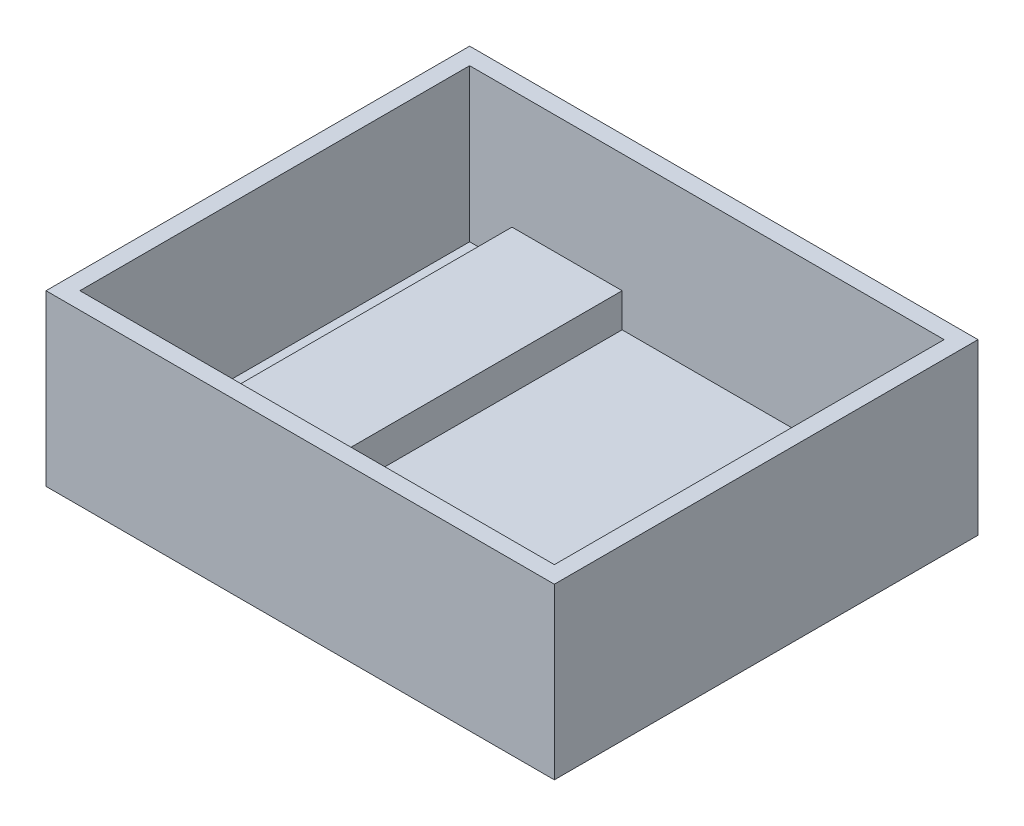
ISO-10303-21;
HEADER;
FILE_DESCRIPTION(('STEP AP214'),'2;1');
FILE_NAME('part.step','',(''),(''),'','','');
FILE_SCHEMA(('AUTOMOTIVE_DESIGN { 1 0 10303 214 1 1 1 1 }'));
ENDSEC;
DATA;
#1=APPLICATION_CONTEXT('core data for automotive mechanical design processes');
#2=APPLICATION_PROTOCOL_DEFINITION('international standard','automotive_design',2000,#1);
#3=PRODUCT_CONTEXT('',#1,'mechanical');
#4=PRODUCT('Part','Part','',(#3));
#5=PRODUCT_RELATED_PRODUCT_CATEGORY('part','',(#4));
#6=PRODUCT_DEFINITION_FORMATION('','',#4);
#7=PRODUCT_DEFINITION_CONTEXT('part definition',#1,'design');
#8=PRODUCT_DEFINITION('design','',#6,#7);
#9=PRODUCT_DEFINITION_SHAPE('','',#8);
#10=(LENGTH_UNIT() NAMED_UNIT(*) SI_UNIT(.MILLI.,.METRE.));
#11=(NAMED_UNIT(*) PLANE_ANGLE_UNIT() SI_UNIT($,.RADIAN.));
#12=(NAMED_UNIT(*) SI_UNIT($,.STERADIAN.) SOLID_ANGLE_UNIT());
#13=UNCERTAINTY_MEASURE_WITH_UNIT(LENGTH_MEASURE(1.E-05),#10,'distance_accuracy_value','');
#14=(GEOMETRIC_REPRESENTATION_CONTEXT(3) GLOBAL_UNCERTAINTY_ASSIGNED_CONTEXT((#13)) GLOBAL_UNIT_ASSIGNED_CONTEXT((#10,
#11,#12)) REPRESENTATION_CONTEXT('',''));
#15=CARTESIAN_POINT('',(0.,0.,0.));
#16=DIRECTION('',(0.,0.,1.));
#17=DIRECTION('',(1.,0.,0.));
#18=AXIS2_PLACEMENT_3D('',#15,#16,#17);
#19=CARTESIAN_POINT('',(-66.5712229422652,4.,-56.0826927806848));
#20=DIRECTION('',(0.,0.,-1.));
#21=DIRECTION('',(-1.,0.,0.));
#22=AXIS2_PLACEMENT_3D('',#19,#20,#21);
#23=PLANE('',#22);
#24=DIRECTION('',(0.,-1.,0.));
#25=VECTOR('',#24,1.);
#26=CARTESIAN_POINT('',(-56.5712229422651,4.,-56.0826927806848));
#27=LINE('',#26,#25);
#28=CARTESIAN_POINT('',(-56.5712229422651,12.,-56.0826927806848));
#29=VERTEX_POINT('',#28);
#30=CARTESIAN_POINT('',(-56.5712229422651,4.,-56.0826927806848));
#31=VERTEX_POINT('',#30);
#32=EDGE_CURVE('E147',#29,#31,#27,.T.);
#33=ORIENTED_EDGE('',*,*,#32,.F.);
#34=DIRECTION('',(1.,0.,0.));
#35=VECTOR('',#34,1.);
#36=CARTESIAN_POINT('',(-66.5712229422652,12.,-56.0826927806848));
#37=LINE('',#36,#35);
#38=CARTESIAN_POINT('',(-30.5712229422651,12.,-56.0826927806848));
#39=VERTEX_POINT('',#38);
#40=EDGE_CURVE('E11',#29,#39,#37,.T.);
#41=ORIENTED_EDGE('',*,*,#40,.T.);
#42=DIRECTION('',(0.,1.,0.));
#43=VECTOR('',#42,1.);
#44=CARTESIAN_POINT('',(-30.5712229422651,4.,-56.0826927806848));
#45=LINE('',#44,#43);
#46=CARTESIAN_POINT('',(-30.5712229422651,4.,-56.0826927806848));
#47=VERTEX_POINT('',#46);
#48=EDGE_CURVE('E145',#47,#39,#45,.T.);
#49=ORIENTED_EDGE('',*,*,#48,.F.);
#50=DIRECTION('',(-1.,0.,0.));
#51=VECTOR('',#50,1.);
#52=CARTESIAN_POINT('',(-66.5712229422652,4.,-56.0826927806848));
#53=LINE('',#52,#51);
#54=CARTESIAN_POINT('',(45.4287770577348,4.,-56.0826927806848));
#55=VERTEX_POINT('',#54);
#56=EDGE_CURVE('E164',#55,#47,#53,.T.);
#57=ORIENTED_EDGE('',*,*,#56,.F.);
#58=DIRECTION('',(0.,1.,0.));
#59=VECTOR('',#58,1.);
#60=CARTESIAN_POINT('',(45.4287770577348,4.,-56.0826927806848));
#61=LINE('',#60,#59);
#62=CARTESIAN_POINT('',(45.4287770577348,40.,-56.0826927806848));
#63=VERTEX_POINT('',#62);
#64=EDGE_CURVE('E180',#55,#63,#61,.T.);
#65=ORIENTED_EDGE('',*,*,#64,.T.);
#66=DIRECTION('',(-1.,0.,0.));
#67=VECTOR('',#66,1.);
#68=CARTESIAN_POINT('',(-66.5712229422652,40.,-56.0826927806848));
#69=LINE('',#68,#67);
#70=CARTESIAN_POINT('',(-66.5712229422652,40.,-56.0826927806848));
#71=VERTEX_POINT('',#70);
#72=EDGE_CURVE('E157',#63,#71,#69,.T.);
#73=ORIENTED_EDGE('',*,*,#72,.T.);
#74=DIRECTION('',(0.,1.,0.));
#75=VECTOR('',#74,1.);
#76=CARTESIAN_POINT('',(-66.5712229422652,4.,-56.0826927806848));
#77=LINE('',#76,#75);
#78=CARTESIAN_POINT('',(-66.5712229422652,4.,-56.0826927806848));
#79=VERTEX_POINT('',#78);
#80=EDGE_CURVE('E177',#79,#71,#77,.T.);
#81=ORIENTED_EDGE('',*,*,#80,.F.);
#82=EDGE_CURVE('E163',#31,#79,#53,.T.);
#83=ORIENTED_EDGE('',*,*,#82,.F.);
#84=EDGE_LOOP('',(#33,#41,#49,#57,#65,#73,#81,#83));
#85=FACE_BOUND('',#84,.T.);
#86=ADVANCED_FACE('F37',(#85),#23,.F.);
#87=CARTESIAN_POINT('',(0.,4.,0.));
#88=DIRECTION('',(0.,1.,0.));
#89=DIRECTION('',(0.,0.,1.));
#90=AXIS2_PLACEMENT_3D('',#87,#88,#89);
#91=PLANE('',#90);
#92=DIRECTION('',(1.,0.,0.));
#93=VECTOR('',#92,1.);
#94=CARTESIAN_POINT('',(-56.5712229422652,4.,9.91730721931521));
#95=LINE('',#94,#93);
#96=CARTESIAN_POINT('',(-56.5712229422652,4.,9.91730721931521));
#97=VERTEX_POINT('',#96);
#98=CARTESIAN_POINT('',(-30.5712229422651,4.,9.91730721931521));
#99=VERTEX_POINT('',#98);
#100=EDGE_CURVE('E218',#97,#99,#95,.T.);
#101=ORIENTED_EDGE('',*,*,#100,.F.);
#102=DIRECTION('',(0.,0.,-1.));
#103=VECTOR('',#102,1.);
#104=CARTESIAN_POINT('',(-56.5712229422652,4.,0.));
#105=LINE('',#104,#103);
#106=EDGE_CURVE('E45',#97,#31,#105,.T.);
#107=ORIENTED_EDGE('',*,*,#106,.T.);
#108=ORIENTED_EDGE('',*,*,#82,.T.);
#109=DIRECTION('',(0.,0.,1.));
#110=VECTOR('',#109,1.);
#111=CARTESIAN_POINT('',(-66.5712229422652,4.,-56.0826927806848));
#112=LINE('',#111,#110);
#113=CARTESIAN_POINT('',(-66.5712229422651,4.,35.9173072193152));
#114=VERTEX_POINT('',#113);
#115=EDGE_CURVE('E153',#79,#114,#112,.T.);
#116=ORIENTED_EDGE('',*,*,#115,.T.);
#117=DIRECTION('',(1.,0.,0.));
#118=VECTOR('',#117,1.);
#119=CARTESIAN_POINT('',(-66.5712229422651,4.,35.9173072193152));
#120=LINE('',#119,#118);
#121=CARTESIAN_POINT('',(45.4287770577348,4.,35.9173072193152));
#122=VERTEX_POINT('',#121);
#123=EDGE_CURVE('E156',#114,#122,#120,.T.);
#124=ORIENTED_EDGE('',*,*,#123,.T.);
#125=DIRECTION('',(0.,0.,-1.));
#126=VECTOR('',#125,1.);
#127=CARTESIAN_POINT('',(45.4287770577348,4.,-56.0826927806848));
#128=LINE('',#127,#126);
#129=EDGE_CURVE('E160',#122,#55,#128,.T.);
#130=ORIENTED_EDGE('',*,*,#129,.T.);
#131=ORIENTED_EDGE('',*,*,#56,.T.);
#132=DIRECTION('',(0.,0.,-1.));
#133=VECTOR('',#132,1.);
#134=CARTESIAN_POINT('',(-30.5712229422651,4.,-60.0826927806848));
#135=LINE('',#134,#133);
#136=EDGE_CURVE('E134',#99,#47,#135,.T.);
#137=ORIENTED_EDGE('',*,*,#136,.F.);
#138=EDGE_LOOP('',(#101,#107,#108,#116,#124,#130,#131,#137));
#139=FACE_BOUND('',#138,.T.);
#140=ADVANCED_FACE('F215',(#139),#91,.T.);
#141=CARTESIAN_POINT('',(-70.5712229422652,40.,39.9173072193152));
#142=DIRECTION('',(1.,0.,0.));
#143=DIRECTION('',(0.,0.,-1.));
#144=AXIS2_PLACEMENT_3D('',#141,#142,#143);
#145=PLANE('',#144);
#146=DIRECTION('',(0.,0.,1.));
#147=VECTOR('',#146,1.);
#148=CARTESIAN_POINT('',(-70.5712229422652,0.,39.9173072193152));
#149=LINE('',#148,#147);
#150=CARTESIAN_POINT('',(-70.5712229422652,0.,-60.0826927806848));
#151=VERTEX_POINT('',#150);
#152=CARTESIAN_POINT('',(-70.5712229422652,0.,39.9173072193152));
#153=VERTEX_POINT('',#152);
#154=EDGE_CURVE('E179',#151,#153,#149,.T.);
#155=ORIENTED_EDGE('',*,*,#154,.T.);
#156=DIRECTION('',(0.,-1.,0.));
#157=VECTOR('',#156,1.);
#158=CARTESIAN_POINT('',(-70.5712229422652,40.,39.9173072193152));
#159=LINE('',#158,#157);
#160=CARTESIAN_POINT('',(-70.5712229422652,40.,39.9173072193152));
#161=VERTEX_POINT('',#160);
#162=EDGE_CURVE('E211',#161,#153,#159,.T.);
#163=ORIENTED_EDGE('',*,*,#162,.F.);
#164=DIRECTION('',(0.,0.,1.));
#165=VECTOR('',#164,1.);
#166=CARTESIAN_POINT('',(-70.5712229422652,40.,39.9173072193152));
#167=LINE('',#166,#165);
#168=CARTESIAN_POINT('',(-70.5712229422652,40.,-60.0826927806848));
#169=VERTEX_POINT('',#168);
#170=EDGE_CURVE('E185',#169,#161,#167,.T.);
#171=ORIENTED_EDGE('',*,*,#170,.F.);
#172=DIRECTION('',(0.,-1.,0.));
#173=VECTOR('',#172,1.);
#174=CARTESIAN_POINT('',(-70.5712229422652,40.,-60.0826927806848));
#175=LINE('',#174,#173);
#176=EDGE_CURVE('E195',#169,#151,#175,.T.);
#177=ORIENTED_EDGE('',*,*,#176,.T.);
#178=EDGE_LOOP('',(#155,#163,#171,#177));
#179=FACE_BOUND('',#178,.T.);
#180=ADVANCED_FACE('F39',(#179),#145,.F.);
#181=CARTESIAN_POINT('',(-70.5712229422652,40.,39.9173072193152));
#182=DIRECTION('',(0.,0.,-1.));
#183=DIRECTION('',(-1.,0.,0.));
#184=AXIS2_PLACEMENT_3D('',#181,#182,#183);
#185=PLANE('',#184);
#186=DIRECTION('',(1.,0.,0.));
#187=VECTOR('',#186,1.);
#188=CARTESIAN_POINT('',(-70.5712229422652,0.,39.9173072193152));
#189=LINE('',#188,#187);
#190=CARTESIAN_POINT('',(49.4287770577348,0.,39.9173072193152));
#191=VERTEX_POINT('',#190);
#192=EDGE_CURVE('E198',#153,#191,#189,.T.);
#193=ORIENTED_EDGE('',*,*,#192,.T.);
#194=DIRECTION('',(0.,-1.,0.));
#195=VECTOR('',#194,1.);
#196=CARTESIAN_POINT('',(49.4287770577348,40.,39.9173072193152));
#197=LINE('',#196,#195);
#198=CARTESIAN_POINT('',(49.4287770577348,40.,39.9173072193152));
#199=VERTEX_POINT('',#198);
#200=EDGE_CURVE('E208',#199,#191,#197,.T.);
#201=ORIENTED_EDGE('',*,*,#200,.F.);
#202=DIRECTION('',(1.,0.,0.));
#203=VECTOR('',#202,1.);
#204=CARTESIAN_POINT('',(-70.5712229422652,40.,39.9173072193152));
#205=LINE('',#204,#203);
#206=EDGE_CURVE('E188',#161,#199,#205,.T.);
#207=ORIENTED_EDGE('',*,*,#206,.F.);
#208=ORIENTED_EDGE('',*,*,#162,.T.);
#209=EDGE_LOOP('',(#193,#201,#207,#208));
#210=FACE_BOUND('',#209,.T.);
#211=ADVANCED_FACE('F272',(#210),#185,.F.);
#212=CARTESIAN_POINT('',(49.4287770577348,40.,39.9173072193152));
#213=DIRECTION('',(-1.,0.,0.));
#214=DIRECTION('',(0.,0.,1.));
#215=AXIS2_PLACEMENT_3D('',#212,#213,#214);
#216=PLANE('',#215);
#217=DIRECTION('',(0.,0.,-1.));
#218=VECTOR('',#217,1.);
#219=CARTESIAN_POINT('',(49.4287770577348,0.,39.9173072193152));
#220=LINE('',#219,#218);
#221=CARTESIAN_POINT('',(49.4287770577348,0.,-60.0826927806848));
#222=VERTEX_POINT('',#221);
#223=EDGE_CURVE('E200',#191,#222,#220,.T.);
#224=ORIENTED_EDGE('',*,*,#223,.T.);
#225=DIRECTION('',(0.,-1.,0.));
#226=VECTOR('',#225,1.);
#227=CARTESIAN_POINT('',(49.4287770577348,40.,-60.0826927806848));
#228=LINE('',#227,#226);
#229=CARTESIAN_POINT('',(49.4287770577348,40.,-60.0826927806848));
#230=VERTEX_POINT('',#229);
#231=EDGE_CURVE('E205',#230,#222,#228,.T.);
#232=ORIENTED_EDGE('',*,*,#231,.F.);
#233=DIRECTION('',(0.,0.,-1.));
#234=VECTOR('',#233,1.);
#235=CARTESIAN_POINT('',(49.4287770577348,40.,39.9173072193152));
#236=LINE('',#235,#234);
#237=EDGE_CURVE('E191',#199,#230,#236,.T.);
#238=ORIENTED_EDGE('',*,*,#237,.F.);
#239=ORIENTED_EDGE('',*,*,#200,.T.);
#240=EDGE_LOOP('',(#224,#232,#238,#239));
#241=FACE_BOUND('',#240,.T.);
#242=ADVANCED_FACE('F269',(#241),#216,.F.);
#243=CARTESIAN_POINT('',(-70.5712229422652,40.,-60.0826927806848));
#244=DIRECTION('',(0.,0.,1.));
#245=DIRECTION('',(1.,0.,0.));
#246=AXIS2_PLACEMENT_3D('',#243,#244,#245);
#247=PLANE('',#246);
#248=DIRECTION('',(-1.,0.,0.));
#249=VECTOR('',#248,1.);
#250=CARTESIAN_POINT('',(-70.5712229422652,0.,-60.0826927806848));
#251=LINE('',#250,#249);
#252=EDGE_CURVE('E189',#222,#151,#251,.T.);
#253=ORIENTED_EDGE('',*,*,#252,.T.);
#254=ORIENTED_EDGE('',*,*,#176,.F.);
#255=DIRECTION('',(-1.,0.,0.));
#256=VECTOR('',#255,1.);
#257=CARTESIAN_POINT('',(-70.5712229422652,40.,-60.0826927806848));
#258=LINE('',#257,#256);
#259=EDGE_CURVE('E193',#230,#169,#258,.T.);
#260=ORIENTED_EDGE('',*,*,#259,.F.);
#261=ORIENTED_EDGE('',*,*,#231,.T.);
#262=EDGE_LOOP('',(#253,#254,#260,#261));
#263=FACE_BOUND('',#262,.T.);
#264=ADVANCED_FACE('F262',(#263),#247,.F.);
#265=CARTESIAN_POINT('',(0.,40.,0.));
#266=DIRECTION('',(0.,-1.,0.));
#267=DIRECTION('',(0.,0.,-1.));
#268=AXIS2_PLACEMENT_3D('',#265,#266,#267);
#269=PLANE('',#268);
#270=DIRECTION('',(1.,0.,0.));
#271=VECTOR('',#270,1.);
#272=CARTESIAN_POINT('',(-66.5712229422651,40.,35.9173072193152));
#273=LINE('',#272,#271);
#274=CARTESIAN_POINT('',(-66.5712229422651,40.,35.9173072193152));
#275=VERTEX_POINT('',#274);
#276=CARTESIAN_POINT('',(45.4287770577348,40.,35.9173072193152));
#277=VERTEX_POINT('',#276);
#278=EDGE_CURVE('E169',#275,#277,#273,.T.);
#279=ORIENTED_EDGE('',*,*,#278,.F.);
#280=DIRECTION('',(0.,0.,1.));
#281=VECTOR('',#280,1.);
#282=CARTESIAN_POINT('',(-66.5712229422652,40.,-56.0826927806848));
#283=LINE('',#282,#281);
#284=EDGE_CURVE('E60',#71,#275,#283,.T.);
#285=ORIENTED_EDGE('',*,*,#284,.F.);
#286=ORIENTED_EDGE('',*,*,#72,.F.);
#287=DIRECTION('',(0.,0.,-1.));
#288=VECTOR('',#287,1.);
#289=CARTESIAN_POINT('',(45.4287770577348,40.,-56.0826927806848));
#290=LINE('',#289,#288);
#291=EDGE_CURVE('E172',#277,#63,#290,.T.);
#292=ORIENTED_EDGE('',*,*,#291,.F.);
#293=EDGE_LOOP('',(#279,#285,#286,#292));
#294=FACE_BOUND('',#293,.T.);
#295=ORIENTED_EDGE('',*,*,#170,.T.);
#296=ORIENTED_EDGE('',*,*,#206,.T.);
#297=ORIENTED_EDGE('',*,*,#237,.T.);
#298=ORIENTED_EDGE('',*,*,#259,.T.);
#299=EDGE_LOOP('',(#295,#296,#297,#298));
#300=FACE_BOUND('',#299,.T.);
#301=ADVANCED_FACE('F259',(#294,#300),#269,.F.);
#302=CARTESIAN_POINT('',(0.,0.,0.));
#303=DIRECTION('',(0.,-1.,0.));
#304=DIRECTION('',(0.,0.,-1.));
#305=AXIS2_PLACEMENT_3D('',#302,#303,#304);
#306=PLANE('',#305);
#307=ORIENTED_EDGE('',*,*,#154,.F.);
#308=ORIENTED_EDGE('',*,*,#252,.F.);
#309=ORIENTED_EDGE('',*,*,#223,.F.);
#310=ORIENTED_EDGE('',*,*,#192,.F.);
#311=EDGE_LOOP('',(#307,#308,#309,#310));
#312=FACE_BOUND('',#311,.T.);
#313=ADVANCED_FACE('F258',(#312),#306,.T.);
#314=CARTESIAN_POINT('',(-66.5712229422652,4.,-56.0826927806848));
#315=DIRECTION('',(-1.,0.,0.));
#316=DIRECTION('',(0.,0.,1.));
#317=AXIS2_PLACEMENT_3D('',#314,#315,#316);
#318=PLANE('',#317);
#319=ORIENTED_EDGE('',*,*,#284,.T.);
#320=DIRECTION('',(0.,1.,0.));
#321=VECTOR('',#320,1.);
#322=CARTESIAN_POINT('',(-66.5712229422651,4.,35.9173072193152));
#323=LINE('',#322,#321);
#324=EDGE_CURVE('E167',#114,#275,#323,.T.);
#325=ORIENTED_EDGE('',*,*,#324,.F.);
#326=ORIENTED_EDGE('',*,*,#115,.F.);
#327=ORIENTED_EDGE('',*,*,#80,.T.);
#328=EDGE_LOOP('',(#319,#325,#326,#327));
#329=FACE_BOUND('',#328,.T.);
#330=ADVANCED_FACE('F222',(#329),#318,.F.);
#331=CARTESIAN_POINT('',(45.4287770577348,4.,-56.0826927806848));
#332=DIRECTION('',(1.,0.,0.));
#333=DIRECTION('',(0.,0.,-1.));
#334=AXIS2_PLACEMENT_3D('',#331,#332,#333);
#335=PLANE('',#334);
#336=ORIENTED_EDGE('',*,*,#291,.T.);
#337=ORIENTED_EDGE('',*,*,#64,.F.);
#338=ORIENTED_EDGE('',*,*,#129,.F.);
#339=DIRECTION('',(0.,1.,0.));
#340=VECTOR('',#339,1.);
#341=CARTESIAN_POINT('',(45.4287770577348,4.,35.9173072193152));
#342=LINE('',#341,#340);
#343=EDGE_CURVE('E182',#122,#277,#342,.T.);
#344=ORIENTED_EDGE('',*,*,#343,.T.);
#345=EDGE_LOOP('',(#336,#337,#338,#344));
#346=FACE_BOUND('',#345,.T.);
#347=ADVANCED_FACE('F231',(#346),#335,.F.);
#348=CARTESIAN_POINT('',(-66.5712229422651,4.,35.9173072193152));
#349=DIRECTION('',(0.,0.,1.));
#350=DIRECTION('',(1.,0.,0.));
#351=AXIS2_PLACEMENT_3D('',#348,#349,#350);
#352=PLANE('',#351);
#353=ORIENTED_EDGE('',*,*,#278,.T.);
#354=ORIENTED_EDGE('',*,*,#343,.F.);
#355=ORIENTED_EDGE('',*,*,#123,.F.);
#356=ORIENTED_EDGE('',*,*,#324,.T.);
#357=EDGE_LOOP('',(#353,#354,#355,#356));
#358=FACE_BOUND('',#357,.T.);
#359=ADVANCED_FACE('F227',(#358),#352,.F.);
#360=CARTESIAN_POINT('',(0.,12.,0.));
#361=DIRECTION('',(0.,1.,0.));
#362=DIRECTION('',(0.,0.,1.));
#363=AXIS2_PLACEMENT_3D('',#360,#361,#362);
#364=PLANE('',#363);
#365=ORIENTED_EDGE('',*,*,#40,.F.);
#366=DIRECTION('',(0.,0.,1.));
#367=VECTOR('',#366,1.);
#368=CARTESIAN_POINT('',(-56.5712229422651,12.,-60.0826927806848));
#369=LINE('',#368,#367);
#370=CARTESIAN_POINT('',(-56.5712229422652,12.,9.91730721931521));
#371=VERTEX_POINT('',#370);
#372=EDGE_CURVE('E126',#29,#371,#369,.T.);
#373=ORIENTED_EDGE('',*,*,#372,.T.);
#374=DIRECTION('',(1.,0.,0.));
#375=VECTOR('',#374,1.);
#376=CARTESIAN_POINT('',(-56.5712229422652,12.,9.91730721931521));
#377=LINE('',#376,#375);
#378=CARTESIAN_POINT('',(-30.5712229422651,12.,9.91730721931521));
#379=VERTEX_POINT('',#378);
#380=EDGE_CURVE('E130',#371,#379,#377,.T.);
#381=ORIENTED_EDGE('',*,*,#380,.T.);
#382=DIRECTION('',(0.,0.,-1.));
#383=VECTOR('',#382,1.);
#384=CARTESIAN_POINT('',(-30.5712229422651,12.,-60.0826927806848));
#385=LINE('',#384,#383);
#386=EDGE_CURVE('E141',#379,#39,#385,.T.);
#387=ORIENTED_EDGE('',*,*,#386,.T.);
#388=EDGE_LOOP('',(#365,#373,#381,#387));
#389=FACE_BOUND('',#388,.T.);
#390=ADVANCED_FACE('F128',(#389),#364,.T.);
#391=CARTESIAN_POINT('',(-56.5712229422651,12.,-60.0826927806848));
#392=DIRECTION('',(1.,0.,0.));
#393=DIRECTION('',(0.,0.,-1.));
#394=AXIS2_PLACEMENT_3D('',#391,#392,#393);
#395=PLANE('',#394);
#396=ORIENTED_EDGE('',*,*,#372,.F.);
#397=ORIENTED_EDGE('',*,*,#32,.T.);
#398=ORIENTED_EDGE('',*,*,#106,.F.);
#399=DIRECTION('',(0.,-1.,0.));
#400=VECTOR('',#399,1.);
#401=CARTESIAN_POINT('',(-56.5712229422652,12.,9.91730721931521));
#402=LINE('',#401,#400);
#403=EDGE_CURVE('E139',#371,#97,#402,.T.);
#404=ORIENTED_EDGE('',*,*,#403,.F.);
#405=EDGE_LOOP('',(#396,#397,#398,#404));
#406=FACE_BOUND('',#405,.T.);
#407=ADVANCED_FACE('F143',(#406),#395,.F.);
#408=CARTESIAN_POINT('',(-30.5712229422651,12.,-60.0826927806848));
#409=DIRECTION('',(-1.,0.,0.));
#410=DIRECTION('',(0.,0.,1.));
#411=AXIS2_PLACEMENT_3D('',#408,#409,#410);
#412=PLANE('',#411);
#413=ORIENTED_EDGE('',*,*,#136,.T.);
#414=ORIENTED_EDGE('',*,*,#48,.T.);
#415=ORIENTED_EDGE('',*,*,#386,.F.);
#416=DIRECTION('',(0.,-1.,0.));
#417=VECTOR('',#416,1.);
#418=CARTESIAN_POINT('',(-30.5712229422651,12.,9.91730721931521));
#419=LINE('',#418,#417);
#420=EDGE_CURVE('E52',#379,#99,#419,.T.);
#421=ORIENTED_EDGE('',*,*,#420,.T.);
#422=EDGE_LOOP('',(#413,#414,#415,#421));
#423=FACE_BOUND('',#422,.T.);
#424=ADVANCED_FACE('F235',(#423),#412,.F.);
#425=CARTESIAN_POINT('',(-56.5712229422652,12.,9.91730721931521));
#426=DIRECTION('',(0.,0.,-1.));
#427=DIRECTION('',(-1.,0.,0.));
#428=AXIS2_PLACEMENT_3D('',#425,#426,#427);
#429=PLANE('',#428);
#430=ORIENTED_EDGE('',*,*,#100,.T.);
#431=ORIENTED_EDGE('',*,*,#420,.F.);
#432=ORIENTED_EDGE('',*,*,#380,.F.);
#433=ORIENTED_EDGE('',*,*,#403,.T.);
#434=EDGE_LOOP('',(#430,#431,#432,#433));
#435=FACE_BOUND('',#434,.T.);
#436=ADVANCED_FACE('F138',(#435),#429,.F.);
#437=CLOSED_SHELL('',(#86,#140,#180,#211,#242,#264,#301,#313,#330,#347,#359,#390,#407,#424,#436));
#438=MANIFOLD_SOLID_BREP('B2',#437);
#439=ADVANCED_BREP_SHAPE_REPRESENTATION('',(#18,#438),#14);
#440=SHAPE_DEFINITION_REPRESENTATION(#9,#439);
ENDSEC;
END-ISO-10303-21;
